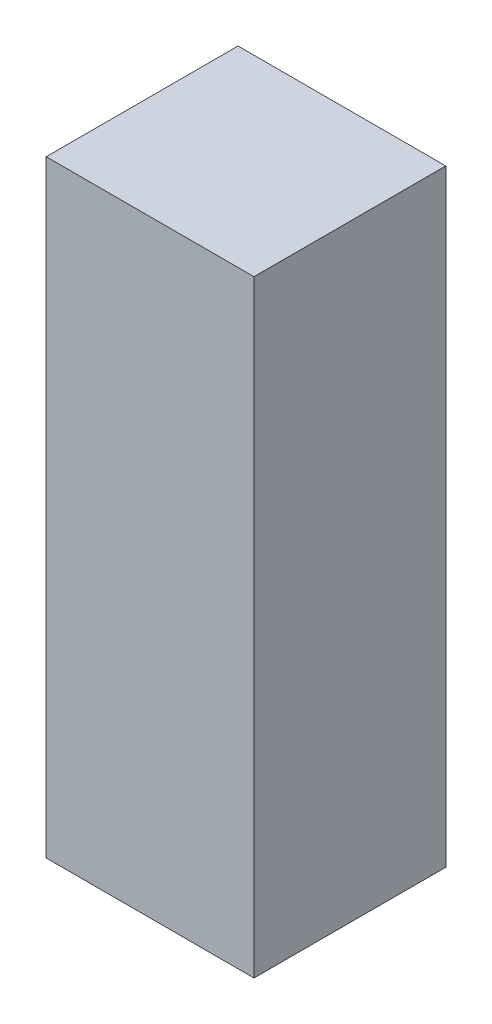
ISO-10303-21;
HEADER;
FILE_DESCRIPTION(('STEP AP214'),'2;1');
FILE_NAME('part.step','',(''),(''),'','','');
FILE_SCHEMA(('AUTOMOTIVE_DESIGN { 1 0 10303 214 1 1 1 1 }'));
ENDSEC;
DATA;
#1=APPLICATION_CONTEXT('core data for automotive mechanical design processes');
#2=APPLICATION_PROTOCOL_DEFINITION('international standard','automotive_design',2000,#1);
#3=PRODUCT_CONTEXT('',#1,'mechanical');
#4=PRODUCT('Part','Part','',(#3));
#5=PRODUCT_RELATED_PRODUCT_CATEGORY('part','',(#4));
#6=PRODUCT_DEFINITION_FORMATION('','',#4);
#7=PRODUCT_DEFINITION_CONTEXT('part definition',#1,'design');
#8=PRODUCT_DEFINITION('design','',#6,#7);
#9=PRODUCT_DEFINITION_SHAPE('','',#8);
#10=(LENGTH_UNIT() NAMED_UNIT(*) SI_UNIT(.MILLI.,.METRE.));
#11=(NAMED_UNIT(*) PLANE_ANGLE_UNIT() SI_UNIT($,.RADIAN.));
#12=(NAMED_UNIT(*) SI_UNIT($,.STERADIAN.) SOLID_ANGLE_UNIT());
#13=UNCERTAINTY_MEASURE_WITH_UNIT(LENGTH_MEASURE(1.E-05),#10,'distance_accuracy_value','');
#14=(GEOMETRIC_REPRESENTATION_CONTEXT(3) GLOBAL_UNCERTAINTY_ASSIGNED_CONTEXT((#13)) GLOBAL_UNIT_ASSIGNED_CONTEXT((#10,
#11,#12)) REPRESENTATION_CONTEXT('',''));
#15=CARTESIAN_POINT('',(0.,0.,0.));
#16=DIRECTION('',(0.,0.,1.));
#17=DIRECTION('',(1.,0.,0.));
#18=AXIS2_PLACEMENT_3D('',#15,#16,#17);
#19=CARTESIAN_POINT('',(0.,1900.,0.));
#20=DIRECTION('',(1.,0.,0.));
#21=DIRECTION('',(0.,0.,-1.));
#22=AXIS2_PLACEMENT_3D('',#19,#20,#21);
#23=PLANE('',#22);
#24=DIRECTION('',(0.,0.,1.));
#25=VECTOR('',#24,1.);
#26=CARTESIAN_POINT('',(0.,0.,0.));
#27=LINE('',#26,#25);
#28=CARTESIAN_POINT('',(0.,0.,0.));
#29=VERTEX_POINT('',#28);
#30=CARTESIAN_POINT('',(0.,0.,600.));
#31=VERTEX_POINT('',#30);
#32=EDGE_CURVE('E98',#29,#31,#27,.T.);
#33=ORIENTED_EDGE('',*,*,#32,.T.);
#34=DIRECTION('',(0.,-1.,0.));
#35=VECTOR('',#34,1.);
#36=CARTESIAN_POINT('',(0.,1900.,600.));
#37=LINE('',#36,#35);
#38=CARTESIAN_POINT('',(0.,1900.,600.));
#39=VERTEX_POINT('',#38);
#40=EDGE_CURVE('E11',#39,#31,#37,.T.);
#41=ORIENTED_EDGE('',*,*,#40,.F.);
#42=DIRECTION('',(0.,0.,1.));
#43=VECTOR('',#42,1.);
#44=CARTESIAN_POINT('',(0.,1900.,0.));
#45=LINE('',#44,#43);
#46=CARTESIAN_POINT('',(0.,1900.,0.));
#47=VERTEX_POINT('',#46);
#48=EDGE_CURVE('E86',#47,#39,#45,.T.);
#49=ORIENTED_EDGE('',*,*,#48,.F.);
#50=DIRECTION('',(0.,-1.,0.));
#51=VECTOR('',#50,1.);
#52=CARTESIAN_POINT('',(0.,1900.,0.));
#53=LINE('',#52,#51);
#54=EDGE_CURVE('E94',#47,#29,#53,.T.);
#55=ORIENTED_EDGE('',*,*,#54,.T.);
#56=EDGE_LOOP('',(#33,#41,#49,#55));
#57=FACE_BOUND('',#56,.T.);
#58=ADVANCED_FACE('F35',(#57),#23,.F.);
#59=CARTESIAN_POINT('',(0.,1900.,600.));
#60=DIRECTION('',(0.,0.,-1.));
#61=DIRECTION('',(-1.,0.,0.));
#62=AXIS2_PLACEMENT_3D('',#59,#60,#61);
#63=PLANE('',#62);
#64=DIRECTION('',(1.,0.,0.));
#65=VECTOR('',#64,1.);
#66=CARTESIAN_POINT('',(0.,0.,600.));
#67=LINE('',#66,#65);
#68=CARTESIAN_POINT('',(650.,0.,600.));
#69=VERTEX_POINT('',#68);
#70=EDGE_CURVE('E90',#31,#69,#67,.T.);
#71=ORIENTED_EDGE('',*,*,#70,.T.);
#72=DIRECTION('',(0.,-1.,0.));
#73=VECTOR('',#72,1.);
#74=CARTESIAN_POINT('',(650.,1900.,600.));
#75=LINE('',#74,#73);
#76=CARTESIAN_POINT('',(650.,1900.,600.));
#77=VERTEX_POINT('',#76);
#78=EDGE_CURVE('E43',#77,#69,#75,.T.);
#79=ORIENTED_EDGE('',*,*,#78,.F.);
#80=DIRECTION('',(1.,0.,0.));
#81=VECTOR('',#80,1.);
#82=CARTESIAN_POINT('',(0.,1900.,600.));
#83=LINE('',#82,#81);
#84=EDGE_CURVE('E81',#39,#77,#83,.T.);
#85=ORIENTED_EDGE('',*,*,#84,.F.);
#86=ORIENTED_EDGE('',*,*,#40,.T.);
#87=EDGE_LOOP('',(#71,#79,#85,#86));
#88=FACE_BOUND('',#87,.T.);
#89=ADVANCED_FACE('F89',(#88),#63,.F.);
#90=CARTESIAN_POINT('',(650.,1900.,0.));
#91=DIRECTION('',(-1.,0.,0.));
#92=DIRECTION('',(0.,0.,1.));
#93=AXIS2_PLACEMENT_3D('',#90,#91,#92);
#94=PLANE('',#93);
#95=DIRECTION('',(0.,0.,-1.));
#96=VECTOR('',#95,1.);
#97=CARTESIAN_POINT('',(650.,0.,0.));
#98=LINE('',#97,#96);
#99=CARTESIAN_POINT('',(650.,0.,0.));
#100=VERTEX_POINT('',#99);
#101=EDGE_CURVE('E68',#69,#100,#98,.T.);
#102=ORIENTED_EDGE('',*,*,#101,.T.);
#103=DIRECTION('',(0.,-1.,0.));
#104=VECTOR('',#103,1.);
#105=CARTESIAN_POINT('',(650.,1900.,0.));
#106=LINE('',#105,#104);
#107=CARTESIAN_POINT('',(650.,1900.,0.));
#108=VERTEX_POINT('',#107);
#109=EDGE_CURVE('E91',#108,#100,#106,.T.);
#110=ORIENTED_EDGE('',*,*,#109,.F.);
#111=DIRECTION('',(0.,0.,-1.));
#112=VECTOR('',#111,1.);
#113=CARTESIAN_POINT('',(650.,1900.,0.));
#114=LINE('',#113,#112);
#115=EDGE_CURVE('E84',#77,#108,#114,.T.);
#116=ORIENTED_EDGE('',*,*,#115,.F.);
#117=ORIENTED_EDGE('',*,*,#78,.T.);
#118=EDGE_LOOP('',(#102,#110,#116,#117));
#119=FACE_BOUND('',#118,.T.);
#120=ADVANCED_FACE('F92',(#119),#94,.F.);
#121=CARTESIAN_POINT('',(0.,1900.,0.));
#122=DIRECTION('',(0.,0.,1.));
#123=DIRECTION('',(1.,0.,0.));
#124=AXIS2_PLACEMENT_3D('',#121,#122,#123);
#125=PLANE('',#124);
#126=DIRECTION('',(-1.,0.,0.));
#127=VECTOR('',#126,1.);
#128=CARTESIAN_POINT('',(0.,0.,0.));
#129=LINE('',#128,#127);
#130=EDGE_CURVE('E74',#100,#29,#129,.T.);
#131=ORIENTED_EDGE('',*,*,#130,.T.);
#132=ORIENTED_EDGE('',*,*,#54,.F.);
#133=DIRECTION('',(-1.,0.,0.));
#134=VECTOR('',#133,1.);
#135=CARTESIAN_POINT('',(0.,1900.,0.));
#136=LINE('',#135,#134);
#137=EDGE_CURVE('E51',#108,#47,#136,.T.);
#138=ORIENTED_EDGE('',*,*,#137,.F.);
#139=ORIENTED_EDGE('',*,*,#109,.T.);
#140=EDGE_LOOP('',(#131,#132,#138,#139));
#141=FACE_BOUND('',#140,.T.);
#142=ADVANCED_FACE('F105',(#141),#125,.F.);
#143=CARTESIAN_POINT('',(0.,1900.,0.));
#144=DIRECTION('',(0.,1.,0.));
#145=DIRECTION('',(0.,0.,1.));
#146=AXIS2_PLACEMENT_3D('',#143,#144,#145);
#147=PLANE('',#146);
#148=ORIENTED_EDGE('',*,*,#48,.T.);
#149=ORIENTED_EDGE('',*,*,#84,.T.);
#150=ORIENTED_EDGE('',*,*,#115,.T.);
#151=ORIENTED_EDGE('',*,*,#137,.T.);
#152=EDGE_LOOP('',(#148,#149,#150,#151));
#153=FACE_BOUND('',#152,.T.);
#154=ADVANCED_FACE('F82',(#153),#147,.T.);
#155=CARTESIAN_POINT('',(0.,0.,0.));
#156=DIRECTION('',(0.,1.,0.));
#157=DIRECTION('',(0.,0.,1.));
#158=AXIS2_PLACEMENT_3D('',#155,#156,#157);
#159=PLANE('',#158);
#160=ORIENTED_EDGE('',*,*,#32,.F.);
#161=ORIENTED_EDGE('',*,*,#130,.F.);
#162=ORIENTED_EDGE('',*,*,#101,.F.);
#163=ORIENTED_EDGE('',*,*,#70,.F.);
#164=EDGE_LOOP('',(#160,#161,#162,#163));
#165=FACE_BOUND('',#164,.T.);
#166=ADVANCED_FACE('F108',(#165),#159,.F.);
#167=CLOSED_SHELL('',(#58,#89,#120,#142,#154,#166));
#168=MANIFOLD_SOLID_BREP('B2',#167);
#169=ADVANCED_BREP_SHAPE_REPRESENTATION('',(#18,#168),#14);
#170=SHAPE_DEFINITION_REPRESENTATION(#9,#169);
ENDSEC;
END-ISO-10303-21;
